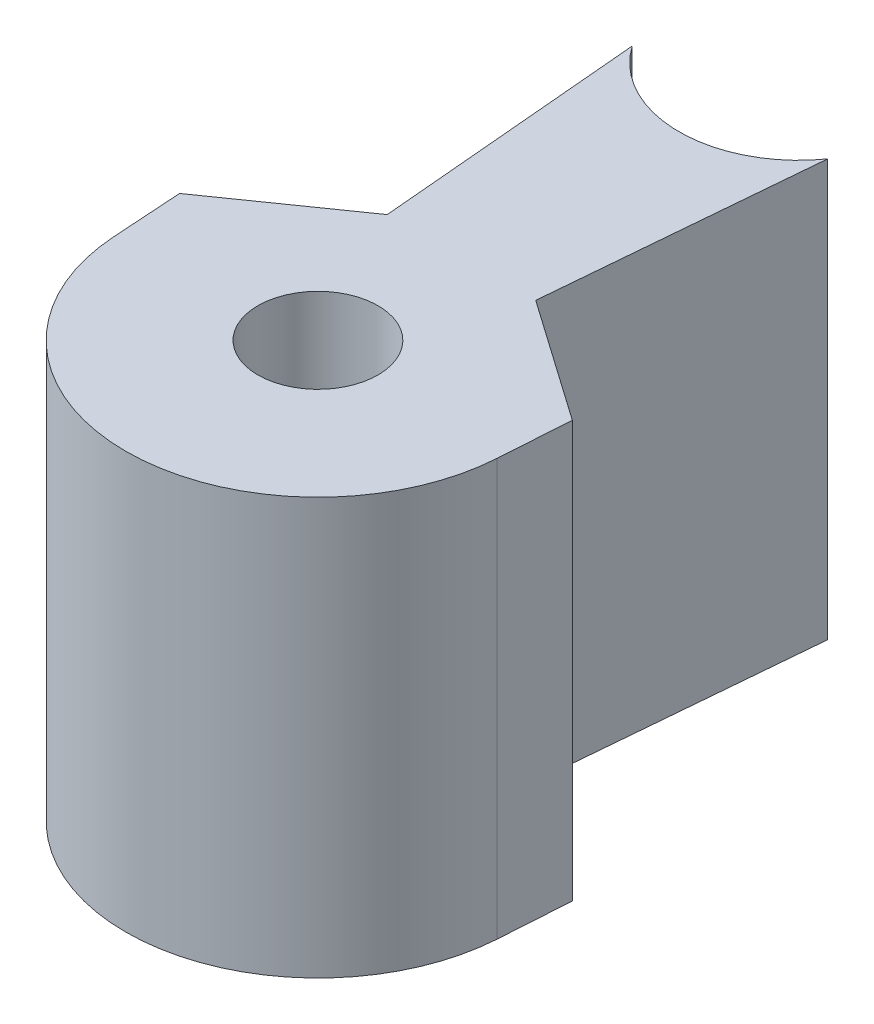
ISO-10303-21;
HEADER;
FILE_DESCRIPTION(('STEP AP214'),'2;1');
FILE_NAME('part.step','',(''),(''),'','','');
FILE_SCHEMA(('AUTOMOTIVE_DESIGN { 1 0 10303 214 1 1 1 1 }'));
ENDSEC;
DATA;
#1=APPLICATION_CONTEXT('core data for automotive mechanical design processes');
#2=APPLICATION_PROTOCOL_DEFINITION('international standard','automotive_design',2000,#1);
#3=PRODUCT_CONTEXT('',#1,'mechanical');
#4=PRODUCT('Part','Part','',(#3));
#5=PRODUCT_RELATED_PRODUCT_CATEGORY('part','',(#4));
#6=PRODUCT_DEFINITION_FORMATION('','',#4);
#7=PRODUCT_DEFINITION_CONTEXT('part definition',#1,'design');
#8=PRODUCT_DEFINITION('design','',#6,#7);
#9=PRODUCT_DEFINITION_SHAPE('','',#8);
#10=(LENGTH_UNIT() NAMED_UNIT(*) SI_UNIT(.MILLI.,.METRE.));
#11=(NAMED_UNIT(*) PLANE_ANGLE_UNIT() SI_UNIT($,.RADIAN.));
#12=(NAMED_UNIT(*) SI_UNIT($,.STERADIAN.) SOLID_ANGLE_UNIT());
#13=UNCERTAINTY_MEASURE_WITH_UNIT(LENGTH_MEASURE(1.E-05),#10,'distance_accuracy_value','');
#14=(GEOMETRIC_REPRESENTATION_CONTEXT(3) GLOBAL_UNCERTAINTY_ASSIGNED_CONTEXT((#13)) GLOBAL_UNIT_ASSIGNED_CONTEXT((#10,
#11,#12)) REPRESENTATION_CONTEXT('',''));
#15=CARTESIAN_POINT('',(0.,0.,0.));
#16=DIRECTION('',(0.,0.,1.));
#17=DIRECTION('',(1.,0.,0.));
#18=AXIS2_PLACEMENT_3D('',#15,#16,#17);
#19=CARTESIAN_POINT('',(0.,1.75,0.));
#20=DIRECTION('',(-0.573576436351044,0.,0.819152044288993));
#21=DIRECTION('',(0.819152044288993,0.,0.573576436351044));
#22=AXIS2_PLACEMENT_3D('',#19,#20,#21);
#23=PLANE('',#22);
#24=DIRECTION('',(0.,-1.,0.));
#25=VECTOR('',#24,1.);
#26=CARTESIAN_POINT('',(0.6102682729953,1.75,0.427314445081528));
#27=LINE('',#26,#25);
#28=CARTESIAN_POINT('',(0.6102682729953,1.75,0.427314445081528));
#29=VERTEX_POINT('',#28);
#30=CARTESIAN_POINT('',(0.6102682729953,0.85,0.427314445081528));
#31=VERTEX_POINT('',#30);
#32=EDGE_CURVE('E40',#29,#31,#27,.T.);
#33=ORIENTED_EDGE('',*,*,#32,.T.);
#34=DIRECTION('',(-0.819152044288993,0.,-0.573576436351044));
#35=VECTOR('',#34,1.);
#36=CARTESIAN_POINT('',(0.,0.85,0.));
#37=LINE('',#36,#35);
#38=CARTESIAN_POINT('',(0.479203945909061,0.85,0.335542215265361));
#39=VERTEX_POINT('',#38);
#40=EDGE_CURVE('E150',#31,#39,#37,.T.);
#41=ORIENTED_EDGE('',*,*,#40,.T.);
#42=DIRECTION('',(0.,-1.,0.));
#43=VECTOR('',#42,1.);
#44=CARTESIAN_POINT('',(0.479203945909061,1.75,0.335542215265361));
#45=LINE('',#44,#43);
#46=CARTESIAN_POINT('',(0.479203945909061,1.75,0.335542215265361));
#47=VERTEX_POINT('',#46);
#48=EDGE_CURVE('E11',#47,#39,#45,.T.);
#49=ORIENTED_EDGE('',*,*,#48,.F.);
#50=DIRECTION('',(-0.819152044288993,0.,-0.573576436351044));
#51=VECTOR('',#50,1.);
#52=CARTESIAN_POINT('',(0.,1.75,0.));
#53=LINE('',#52,#51);
#54=EDGE_CURVE('E166',#29,#47,#53,.T.);
#55=ORIENTED_EDGE('',*,*,#54,.F.);
#56=EDGE_LOOP('',(#33,#41,#49,#55));
#57=FACE_BOUND('',#56,.T.);
#58=ADVANCED_FACE('F37',(#57),#23,.F.);
#59=CARTESIAN_POINT('',(0.,1.75,0.));
#60=DIRECTION('',(0.,-1.,0.));
#61=DIRECTION('',(0.,0.,-1.));
#62=AXIS2_PLACEMENT_3D('',#59,#60,#61);
#63=CYLINDRICAL_SURFACE('',#62,0.585);
#64=ORIENTED_EDGE('',*,*,#48,.T.);
#65=CARTESIAN_POINT('',(0.,0.85,0.));
#66=DIRECTION('',(0.,-1.,0.));
#67=DIRECTION('',(0.,0.,-1.));
#68=AXIS2_PLACEMENT_3D('',#65,#66,#67);
#69=CIRCLE('',#68,0.585);
#70=CARTESIAN_POINT('',(-0.479203945909061,0.85,0.335542215265361));
#71=VERTEX_POINT('',#70);
#72=EDGE_CURVE('E163',#39,#71,#69,.T.);
#73=ORIENTED_EDGE('',*,*,#72,.T.);
#74=DIRECTION('',(0.,-1.,0.));
#75=VECTOR('',#74,1.);
#76=CARTESIAN_POINT('',(-0.479203945909061,1.75,0.335542215265361));
#77=LINE('',#76,#75);
#78=CARTESIAN_POINT('',(-0.479203945909061,1.75,0.335542215265361));
#79=VERTEX_POINT('',#78);
#80=EDGE_CURVE('E45',#79,#71,#77,.T.);
#81=ORIENTED_EDGE('',*,*,#80,.F.);
#82=CARTESIAN_POINT('',(0.,1.75,0.));
#83=DIRECTION('',(0.,-1.,0.));
#84=DIRECTION('',(0.,0.,-1.));
#85=AXIS2_PLACEMENT_3D('',#82,#83,#84);
#86=CIRCLE('',#85,0.585);
#87=EDGE_CURVE('E52',#47,#79,#86,.T.);
#88=ORIENTED_EDGE('',*,*,#87,.F.);
#89=EDGE_LOOP('',(#64,#73,#81,#88));
#90=FACE_BOUND('',#89,.T.);
#91=ADVANCED_FACE('F272',(#90),#63,.F.);
#92=CARTESIAN_POINT('',(0.,1.75,0.));
#93=DIRECTION('',(0.573576436351044,0.,0.819152044288993));
#94=DIRECTION('',(0.819152044288993,0.,-0.573576436351044));
#95=AXIS2_PLACEMENT_3D('',#92,#93,#94);
#96=PLANE('',#95);
#97=ORIENTED_EDGE('',*,*,#80,.T.);
#98=DIRECTION('',(-0.819152044288993,0.,0.573576436351044));
#99=VECTOR('',#98,1.);
#100=CARTESIAN_POINT('',(0.,0.85,0.));
#101=LINE('',#100,#99);
#102=CARTESIAN_POINT('',(-0.6102682729953,0.85,0.427314445081528));
#103=VERTEX_POINT('',#102);
#104=EDGE_CURVE('E160',#71,#103,#101,.T.);
#105=ORIENTED_EDGE('',*,*,#104,.T.);
#106=DIRECTION('',(0.,-1.,0.));
#107=VECTOR('',#106,1.);
#108=CARTESIAN_POINT('',(-0.6102682729953,1.75,0.427314445081528));
#109=LINE('',#108,#107);
#110=CARTESIAN_POINT('',(-0.6102682729953,1.75,0.427314445081528));
#111=VERTEX_POINT('',#110);
#112=EDGE_CURVE('E174',#111,#103,#109,.T.);
#113=ORIENTED_EDGE('',*,*,#112,.F.);
#114=DIRECTION('',(-0.819152044288993,0.,0.573576436351044));
#115=VECTOR('',#114,1.);
#116=CARTESIAN_POINT('',(0.,1.75,0.));
#117=LINE('',#116,#115);
#118=EDGE_CURVE('E171',#79,#111,#117,.T.);
#119=ORIENTED_EDGE('',*,*,#118,.F.);
#120=EDGE_LOOP('',(#97,#105,#113,#119));
#121=FACE_BOUND('',#120,.T.);
#122=ADVANCED_FACE('F276',(#121),#96,.F.);
#123=CARTESIAN_POINT('',(0.,1.75,0.));
#124=DIRECTION('',(0.,-1.,0.));
#125=DIRECTION('',(0.,0.,-1.));
#126=AXIS2_PLACEMENT_3D('',#123,#124,#125);
#127=PLANE('',#126);
#128=ORIENTED_EDGE('',*,*,#54,.T.);
#129=ORIENTED_EDGE('',*,*,#87,.T.);
#130=ORIENTED_EDGE('',*,*,#118,.T.);
#131=CARTESIAN_POINT('',(0.,1.75,0.));
#132=DIRECTION('',(0.,-1.,0.));
#133=DIRECTION('',(0.,0.,-1.));
#134=AXIS2_PLACEMENT_3D('',#131,#132,#133);
#135=CIRCLE('',#134,0.745);
#136=EDGE_CURVE('E168',#29,#111,#135,.T.);
#137=ORIENTED_EDGE('',*,*,#136,.F.);
#138=EDGE_LOOP('',(#128,#129,#130,#137));
#139=FACE_BOUND('',#138,.T.);
#140=ADVANCED_FACE('F281',(#139),#127,.F.);
#141=CARTESIAN_POINT('',(0.,0.85,0.));
#142=DIRECTION('',(0.,-1.,0.));
#143=DIRECTION('',(0.,0.,-1.));
#144=AXIS2_PLACEMENT_3D('',#141,#142,#143);
#145=PLANE('',#144);
#146=ORIENTED_EDGE('',*,*,#40,.F.);
#147=CARTESIAN_POINT('',(0.,0.85,0.));
#148=DIRECTION('',(0.,-1.,0.));
#149=DIRECTION('',(0.,0.,-1.));
#150=AXIS2_PLACEMENT_3D('',#147,#148,#149);
#151=CIRCLE('',#150,0.745);
#152=EDGE_CURVE('E153',#31,#103,#151,.T.);
#153=ORIENTED_EDGE('',*,*,#152,.T.);
#154=ORIENTED_EDGE('',*,*,#104,.F.);
#155=ORIENTED_EDGE('',*,*,#72,.F.);
#156=EDGE_LOOP('',(#146,#153,#154,#155));
#157=FACE_BOUND('',#156,.T.);
#158=ADVANCED_FACE('F189',(#157),#145,.T.);
#159=CARTESIAN_POINT('',(0.,2.6,0.));
#160=DIRECTION('',(0.,-1.,0.));
#161=DIRECTION('',(0.,0.,-1.));
#162=AXIS2_PLACEMENT_3D('',#159,#160,#161);
#163=CYLINDRICAL_SURFACE('',#162,0.745);
#164=ORIENTED_EDGE('',*,*,#152,.F.);
#165=DIRECTION('',(0.,-1.,0.));
#166=VECTOR('',#165,1.);
#167=CARTESIAN_POINT('',(0.6102682729953,2.6,0.427314445081528));
#168=LINE('',#167,#166);
#169=CARTESIAN_POINT('',(0.6102682729953,0.,0.427314445081528));
#170=VERTEX_POINT('',#169);
#171=EDGE_CURVE('E195',#31,#170,#168,.T.);
#172=ORIENTED_EDGE('',*,*,#171,.T.);
#173=CARTESIAN_POINT('',(0.,0.,0.));
#174=DIRECTION('',(0.,1.,0.));
#175=DIRECTION('',(0.,0.,1.));
#176=AXIS2_PLACEMENT_3D('',#173,#174,#175);
#177=CIRCLE('',#176,0.745);
#178=CARTESIAN_POINT('',(-0.6102682729953,0.,0.427314445081528));
#179=VERTEX_POINT('',#178);
#180=EDGE_CURVE('E227',#179,#170,#177,.T.);
#181=ORIENTED_EDGE('',*,*,#180,.F.);
#182=DIRECTION('',(0.,-1.,0.));
#183=VECTOR('',#182,1.);
#184=CARTESIAN_POINT('',(-0.6102682729953,2.6,0.427314445081528));
#185=LINE('',#184,#183);
#186=EDGE_CURVE('E197',#103,#179,#185,.T.);
#187=ORIENTED_EDGE('',*,*,#186,.F.);
#188=EDGE_LOOP('',(#164,#172,#181,#187));
#189=FACE_BOUND('',#188,.T.);
#190=ADVANCED_FACE('F193',(#189),#163,.F.);
#191=CARTESIAN_POINT('',(-1.39204994320427,2.6,0.0906750000000001));
#192=DIRECTION('',(0.99788526394571,0.,-0.0650000000000001));
#193=DIRECTION('',(-0.0650000000000001,0.,-0.99788526394571));
#194=AXIS2_PLACEMENT_3D('',#191,#192,#193);
#195=PLANE('',#194);
#196=DIRECTION('',(0.065,0.,0.99788526394571));
#197=VECTOR('',#196,1.);
#198=CARTESIAN_POINT('',(-1.39204994320427,0.,0.0906750000000001));
#199=LINE('',#198,#197);
#200=CARTESIAN_POINT('',(-1.22613750826478,0.,2.63777613740721));
#201=VERTEX_POINT('',#200);
#202=CARTESIAN_POINT('',(-1.19746231673485,0.,3.078));
#203=VERTEX_POINT('',#202);
#204=EDGE_CURVE('E149',#201,#203,#199,.T.);
#205=ORIENTED_EDGE('',*,*,#204,.T.);
#206=DIRECTION('',(0.,-1.,0.));
#207=VECTOR('',#206,1.);
#208=CARTESIAN_POINT('',(-1.19746231673485,2.6,3.078));
#209=LINE('',#208,#207);
#210=CARTESIAN_POINT('',(-1.19746231673485,2.6,3.078));
#211=VERTEX_POINT('',#210);
#212=EDGE_CURVE('E129',#211,#203,#209,.T.);
#213=ORIENTED_EDGE('',*,*,#212,.F.);
#214=DIRECTION('',(0.065,0.,0.99788526394571));
#215=VECTOR('',#214,1.);
#216=CARTESIAN_POINT('',(-1.39204994320427,2.6,0.0906750000000001));
#217=LINE('',#216,#215);
#218=CARTESIAN_POINT('',(-1.22613750826478,2.6,2.63777613740721));
#219=VERTEX_POINT('',#218);
#220=EDGE_CURVE('E136',#219,#211,#217,.T.);
#221=ORIENTED_EDGE('',*,*,#220,.F.);
#222=DIRECTION('',(0.,-1.,0.));
#223=VECTOR('',#222,1.);
#224=CARTESIAN_POINT('',(-1.22613750826478,2.6,2.63777613740721));
#225=LINE('',#224,#223);
#226=EDGE_CURVE('E236',#219,#201,#225,.T.);
#227=ORIENTED_EDGE('',*,*,#226,.T.);
#228=EDGE_LOOP('',(#205,#213,#221,#227));
#229=FACE_BOUND('',#228,.T.);
#230=ADVANCED_FACE('F147',(#229),#195,.F.);
#231=CARTESIAN_POINT('',(0.,2.6,3.));
#232=DIRECTION('',(0.,-1.,0.));
#233=DIRECTION('',(0.,0.,-1.));
#234=AXIS2_PLACEMENT_3D('',#231,#232,#233);
#235=CYLINDRICAL_SURFACE('',#234,1.2);
#236=CARTESIAN_POINT('',(0.,0.,3.));
#237=DIRECTION('',(0.,1.,0.));
#238=DIRECTION('',(0.,0.,1.));
#239=AXIS2_PLACEMENT_3D('',#236,#237,#238);
#240=CIRCLE('',#239,1.2);
#241=CARTESIAN_POINT('',(1.19746231673485,0.,3.078));
#242=VERTEX_POINT('',#241);
#243=EDGE_CURVE('E223',#203,#242,#240,.T.);
#244=ORIENTED_EDGE('',*,*,#243,.T.);
#245=DIRECTION('',(0.,-1.,0.));
#246=VECTOR('',#245,1.);
#247=CARTESIAN_POINT('',(1.19746231673485,2.6,3.078));
#248=LINE('',#247,#246);
#249=CARTESIAN_POINT('',(1.19746231673485,2.6,3.078));
#250=VERTEX_POINT('',#249);
#251=EDGE_CURVE('E131',#250,#242,#248,.T.);
#252=ORIENTED_EDGE('',*,*,#251,.F.);
#253=CARTESIAN_POINT('',(0.,2.6,3.));
#254=DIRECTION('',(0.,1.,0.));
#255=DIRECTION('',(0.,0.,1.));
#256=AXIS2_PLACEMENT_3D('',#253,#254,#255);
#257=CIRCLE('',#256,1.2);
#258=EDGE_CURVE('E124',#211,#250,#257,.T.);
#259=ORIENTED_EDGE('',*,*,#258,.F.);
#260=ORIENTED_EDGE('',*,*,#212,.T.);
#261=EDGE_LOOP('',(#244,#252,#259,#260));
#262=FACE_BOUND('',#261,.T.);
#263=ADVANCED_FACE('F127',(#262),#235,.T.);
#264=CARTESIAN_POINT('',(1.39204994320427,2.6,0.0906750000000001));
#265=DIRECTION('',(0.99788526394571,0.,0.0650000000000001));
#266=DIRECTION('',(0.0650000000000001,0.,-0.99788526394571));
#267=AXIS2_PLACEMENT_3D('',#264,#265,#266);
#268=PLANE('',#267);
#269=DIRECTION('',(-0.065,0.,0.99788526394571));
#270=VECTOR('',#269,1.);
#271=CARTESIAN_POINT('',(1.39204994320427,0.,0.0906750000000001));
#272=LINE('',#271,#270);
#273=CARTESIAN_POINT('',(1.22613750826478,0.,2.63777613740721));
#274=VERTEX_POINT('',#273);
#275=EDGE_CURVE('E220',#274,#242,#272,.T.);
#276=ORIENTED_EDGE('',*,*,#275,.F.);
#277=DIRECTION('',(0.,-1.,0.));
#278=VECTOR('',#277,1.);
#279=CARTESIAN_POINT('',(1.22613750826478,2.6,2.63777613740721));
#280=LINE('',#279,#278);
#281=CARTESIAN_POINT('',(1.22613750826478,2.6,2.63777613740721));
#282=VERTEX_POINT('',#281);
#283=EDGE_CURVE('E155',#282,#274,#280,.T.);
#284=ORIENTED_EDGE('',*,*,#283,.F.);
#285=DIRECTION('',(-0.065,0.,0.99788526394571));
#286=VECTOR('',#285,1.);
#287=CARTESIAN_POINT('',(1.39204994320427,2.6,0.0906750000000001));
#288=LINE('',#287,#286);
#289=EDGE_CURVE('E135',#282,#250,#288,.T.);
#290=ORIENTED_EDGE('',*,*,#289,.T.);
#291=ORIENTED_EDGE('',*,*,#251,.T.);
#292=EDGE_LOOP('',(#276,#284,#290,#291));
#293=FACE_BOUND('',#292,.T.);
#294=ADVANCED_FACE('F221',(#293),#268,.T.);
#295=CARTESIAN_POINT('',(-0.835962494827816,2.6,1.19387817069952));
#296=DIRECTION('',(0.573576436351044,0.,-0.819152044288993));
#297=DIRECTION('',(-0.819152044288993,0.,-0.573576436351044));
#298=AXIS2_PLACEMENT_3D('',#295,#296,#297);
#299=PLANE('',#298);
#300=DIRECTION('',(0.819152044288993,0.,0.573576436351044));
#301=VECTOR('',#300,1.);
#302=CARTESIAN_POINT('',(-0.835962494827816,0.,1.19387817069952));
#303=LINE('',#302,#301);
#304=CARTESIAN_POINT('',(0.463591661400463,0.,2.10383578720231));
#305=VERTEX_POINT('',#304);
#306=EDGE_CURVE('E215',#305,#274,#303,.T.);
#307=ORIENTED_EDGE('',*,*,#306,.F.);
#308=DIRECTION('',(0.,-1.,0.));
#309=VECTOR('',#308,1.);
#310=CARTESIAN_POINT('',(0.463591661400463,2.6,2.10383578720231));
#311=LINE('',#310,#309);
#312=CARTESIAN_POINT('',(0.463591661400463,2.6,2.10383578720231));
#313=VERTEX_POINT('',#312);
#314=EDGE_CURVE('E205',#313,#305,#311,.T.);
#315=ORIENTED_EDGE('',*,*,#314,.F.);
#316=DIRECTION('',(0.819152044288993,0.,0.573576436351044));
#317=VECTOR('',#316,1.);
#318=CARTESIAN_POINT('',(-0.835962494827816,2.6,1.19387817069952));
#319=LINE('',#318,#317);
#320=EDGE_CURVE('E217',#313,#282,#319,.T.);
#321=ORIENTED_EDGE('',*,*,#320,.T.);
#322=ORIENTED_EDGE('',*,*,#283,.T.);
#323=EDGE_LOOP('',(#307,#315,#321,#322));
#324=FACE_BOUND('',#323,.T.);
#325=ADVANCED_FACE('F213',(#324),#299,.T.);
#326=CARTESIAN_POINT('',(0.642733787168803,2.6,0.0562319200423545));
#327=DIRECTION('',(0.996194698091746,0.,0.0871557427476585));
#328=DIRECTION('',(0.0871557427476585,0.,-0.996194698091746));
#329=AXIS2_PLACEMENT_3D('',#326,#327,#328);
#330=PLANE('',#329);
#331=DIRECTION('',(-0.0871557427476586,0.,0.996194698091746));
#332=VECTOR('',#331,1.);
#333=CARTESIAN_POINT('',(0.642733787168803,0.,0.0562319200423545));
#334=LINE('',#333,#332);
#335=EDGE_CURVE('E200',#170,#305,#334,.T.);
#336=ORIENTED_EDGE('',*,*,#335,.F.);
#337=ORIENTED_EDGE('',*,*,#171,.F.);
#338=ORIENTED_EDGE('',*,*,#32,.F.);
#339=CARTESIAN_POINT('',(0.6102682729953,2.6,0.427314445081528));
#340=VERTEX_POINT('',#339);
#341=EDGE_CURVE('E202',#340,#29,#168,.T.);
#342=ORIENTED_EDGE('',*,*,#341,.F.);
#343=DIRECTION('',(-0.0871557427476586,0.,0.996194698091746));
#344=VECTOR('',#343,1.);
#345=CARTESIAN_POINT('',(0.642733787168803,2.6,0.0562319200423545));
#346=LINE('',#345,#344);
#347=EDGE_CURVE('E303',#340,#313,#346,.T.);
#348=ORIENTED_EDGE('',*,*,#347,.T.);
#349=ORIENTED_EDGE('',*,*,#314,.T.);
#350=EDGE_LOOP('',(#336,#337,#338,#342,#348,#349));
#351=FACE_BOUND('',#350,.T.);
#352=ADVANCED_FACE('F198',(#351),#330,.T.);
#353=ORIENTED_EDGE('',*,*,#341,.T.);
#354=ORIENTED_EDGE('',*,*,#136,.T.);
#355=CARTESIAN_POINT('',(-0.6102682729953,2.6,0.427314445081528));
#356=VERTEX_POINT('',#355);
#357=EDGE_CURVE('E203',#356,#111,#185,.T.);
#358=ORIENTED_EDGE('',*,*,#357,.F.);
#359=CARTESIAN_POINT('',(0.,2.6,0.));
#360=DIRECTION('',(0.,1.,0.));
#361=DIRECTION('',(0.,0.,1.));
#362=AXIS2_PLACEMENT_3D('',#359,#360,#361);
#363=CIRCLE('',#362,0.745);
#364=EDGE_CURVE('E247',#356,#340,#363,.T.);
#365=ORIENTED_EDGE('',*,*,#364,.T.);
#366=EDGE_LOOP('',(#353,#354,#358,#365));
#367=FACE_BOUND('',#366,.T.);
#368=ADVANCED_FACE('F266',(#367),#163,.F.);
#369=CARTESIAN_POINT('',(-0.642733787168803,2.6,0.0562319200423545));
#370=DIRECTION('',(0.996194698091746,0.,-0.0871557427476585));
#371=DIRECTION('',(-0.0871557427476585,0.,-0.996194698091746));
#372=AXIS2_PLACEMENT_3D('',#369,#370,#371);
#373=PLANE('',#372);
#374=DIRECTION('',(0.0871557427476586,0.,0.996194698091746));
#375=VECTOR('',#374,1.);
#376=CARTESIAN_POINT('',(-0.642733787168803,0.,0.0562319200423545));
#377=LINE('',#376,#375);
#378=CARTESIAN_POINT('',(-0.463591661400463,0.,2.10383578720231));
#379=VERTEX_POINT('',#378);
#380=EDGE_CURVE('E232',#179,#379,#377,.T.);
#381=ORIENTED_EDGE('',*,*,#380,.T.);
#382=DIRECTION('',(0.,-1.,0.));
#383=VECTOR('',#382,1.);
#384=CARTESIAN_POINT('',(-0.463591661400463,2.6,2.10383578720231));
#385=LINE('',#384,#383);
#386=CARTESIAN_POINT('',(-0.463591661400463,2.6,2.10383578720231));
#387=VERTEX_POINT('',#386);
#388=EDGE_CURVE('E237',#387,#379,#385,.T.);
#389=ORIENTED_EDGE('',*,*,#388,.F.);
#390=DIRECTION('',(0.0871557427476586,0.,0.996194698091746));
#391=VECTOR('',#390,1.);
#392=CARTESIAN_POINT('',(-0.642733787168803,2.6,0.0562319200423545));
#393=LINE('',#392,#391);
#394=EDGE_CURVE('E245',#356,#387,#393,.T.);
#395=ORIENTED_EDGE('',*,*,#394,.F.);
#396=ORIENTED_EDGE('',*,*,#357,.T.);
#397=ORIENTED_EDGE('',*,*,#112,.T.);
#398=ORIENTED_EDGE('',*,*,#186,.T.);
#399=EDGE_LOOP('',(#381,#389,#395,#396,#397,#398));
#400=FACE_BOUND('',#399,.T.);
#401=ADVANCED_FACE('F243',(#400),#373,.F.);
#402=CARTESIAN_POINT('',(0.,2.6,3.));
#403=DIRECTION('',(0.,-1.,0.));
#404=DIRECTION('',(0.,0.,-1.));
#405=AXIS2_PLACEMENT_3D('',#402,#403,#404);
#406=CYLINDRICAL_SURFACE('',#405,0.375);
#407=CARTESIAN_POINT('',(0.,2.6,3.));
#408=DIRECTION('',(0.,1.,0.));
#409=DIRECTION('',(0.,0.,1.));
#410=AXIS2_PLACEMENT_3D('',#407,#408,#409);
#411=CIRCLE('',#410,0.375);
#412=CARTESIAN_POINT('',(0.,2.6,3.375));
#413=VERTEX_POINT('',#412);
#414=EDGE_CURVE('E145',#413,#413,#411,.T.);
#415=ORIENTED_EDGE('',*,*,#414,.T.);
#416=EDGE_LOOP('',(#415));
#417=FACE_BOUND('',#416,.T.);
#418=CARTESIAN_POINT('',(0.,0.,3.));
#419=DIRECTION('',(0.,1.,0.));
#420=DIRECTION('',(0.,0.,1.));
#421=AXIS2_PLACEMENT_3D('',#418,#419,#420);
#422=CIRCLE('',#421,0.375);
#423=CARTESIAN_POINT('',(0.,0.,3.375));
#424=VERTEX_POINT('',#423);
#425=EDGE_CURVE('E251',#424,#424,#422,.T.);
#426=ORIENTED_EDGE('',*,*,#425,.F.);
#427=EDGE_LOOP('',(#426));
#428=FACE_BOUND('',#427,.T.);
#429=ADVANCED_FACE('F257',(#417,#428),#406,.F.);
#430=CARTESIAN_POINT('',(0.835962494827816,2.6,1.19387817069952));
#431=DIRECTION('',(0.573576436351044,0.,0.819152044288993));
#432=DIRECTION('',(0.819152044288993,0.,-0.573576436351044));
#433=AXIS2_PLACEMENT_3D('',#430,#431,#432);
#434=PLANE('',#433);
#435=DIRECTION('',(-0.819152044288993,0.,0.573576436351044));
#436=VECTOR('',#435,1.);
#437=CARTESIAN_POINT('',(0.835962494827816,0.,1.19387817069952));
#438=LINE('',#437,#436);
#439=EDGE_CURVE('E234',#379,#201,#438,.T.);
#440=ORIENTED_EDGE('',*,*,#439,.T.);
#441=ORIENTED_EDGE('',*,*,#226,.F.);
#442=DIRECTION('',(-0.819152044288993,0.,0.573576436351044));
#443=VECTOR('',#442,1.);
#444=CARTESIAN_POINT('',(0.835962494827816,2.6,1.19387817069952));
#445=LINE('',#444,#443);
#446=EDGE_CURVE('E141',#387,#219,#445,.T.);
#447=ORIENTED_EDGE('',*,*,#446,.F.);
#448=ORIENTED_EDGE('',*,*,#388,.T.);
#449=EDGE_LOOP('',(#440,#441,#447,#448));
#450=FACE_BOUND('',#449,.T.);
#451=ADVANCED_FACE('F244',(#450),#434,.F.);
#452=CARTESIAN_POINT('',(0.,2.6,0.));
#453=DIRECTION('',(0.,1.,0.));
#454=DIRECTION('',(0.,0.,1.));
#455=AXIS2_PLACEMENT_3D('',#452,#453,#454);
#456=PLANE('',#455);
#457=ORIENTED_EDGE('',*,*,#414,.F.);
#458=EDGE_LOOP('',(#457));
#459=FACE_BOUND('',#458,.T.);
#460=ORIENTED_EDGE('',*,*,#220,.T.);
#461=ORIENTED_EDGE('',*,*,#258,.T.);
#462=ORIENTED_EDGE('',*,*,#289,.F.);
#463=ORIENTED_EDGE('',*,*,#320,.F.);
#464=ORIENTED_EDGE('',*,*,#347,.F.);
#465=ORIENTED_EDGE('',*,*,#364,.F.);
#466=ORIENTED_EDGE('',*,*,#394,.T.);
#467=ORIENTED_EDGE('',*,*,#446,.T.);
#468=EDGE_LOOP('',(#460,#461,#462,#463,#464,#465,#466,#467));
#469=FACE_BOUND('',#468,.T.);
#470=ADVANCED_FACE('F139',(#459,#469),#456,.T.);
#471=CARTESIAN_POINT('',(0.,0.,0.));
#472=DIRECTION('',(0.,1.,0.));
#473=DIRECTION('',(0.,0.,1.));
#474=AXIS2_PLACEMENT_3D('',#471,#472,#473);
#475=PLANE('',#474);
#476=ORIENTED_EDGE('',*,*,#425,.T.);
#477=EDGE_LOOP('',(#476));
#478=FACE_BOUND('',#477,.T.);
#479=ORIENTED_EDGE('',*,*,#204,.F.);
#480=ORIENTED_EDGE('',*,*,#439,.F.);
#481=ORIENTED_EDGE('',*,*,#380,.F.);
#482=ORIENTED_EDGE('',*,*,#180,.T.);
#483=ORIENTED_EDGE('',*,*,#335,.T.);
#484=ORIENTED_EDGE('',*,*,#306,.T.);
#485=ORIENTED_EDGE('',*,*,#275,.T.);
#486=ORIENTED_EDGE('',*,*,#243,.F.);
#487=EDGE_LOOP('',(#479,#480,#481,#482,#483,#484,#485,#486));
#488=FACE_BOUND('',#487,.T.);
#489=ADVANCED_FACE('F225',(#478,#488),#475,.F.);
#490=CLOSED_SHELL('',(#58,#91,#122,#140,#158,#190,#230,#263,#294,#325,#352,#368,#401,#429,#451,
#470,#489));
#491=MANIFOLD_SOLID_BREP('B2',#490);
#492=ADVANCED_BREP_SHAPE_REPRESENTATION('',(#18,#491),#14);
#493=SHAPE_DEFINITION_REPRESENTATION(#9,#492);
ENDSEC;
END-ISO-10303-21;
